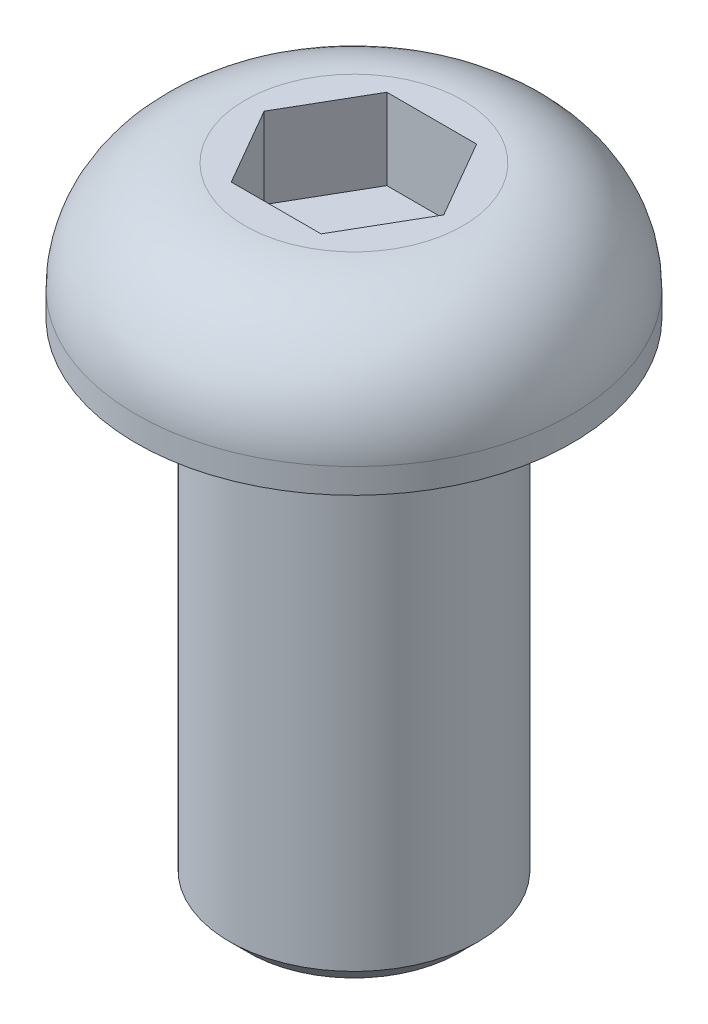
ISO-10303-21;
HEADER;
FILE_DESCRIPTION(('STEP AP214'),'2;1');
FILE_NAME('part.step','',(''),(''),'','','');
FILE_SCHEMA(('AUTOMOTIVE_DESIGN { 1 0 10303 214 1 1 1 1 }'));
ENDSEC;
DATA;
#1=APPLICATION_CONTEXT('core data for automotive mechanical design processes');
#2=APPLICATION_PROTOCOL_DEFINITION('international standard','automotive_design',2000,#1);
#3=PRODUCT_CONTEXT('',#1,'mechanical');
#4=PRODUCT('Part','Part','',(#3));
#5=PRODUCT_RELATED_PRODUCT_CATEGORY('part','',(#4));
#6=PRODUCT_DEFINITION_FORMATION('','',#4);
#7=PRODUCT_DEFINITION_CONTEXT('part definition',#1,'design');
#8=PRODUCT_DEFINITION('design','',#6,#7);
#9=PRODUCT_DEFINITION_SHAPE('','',#8);
#10=(LENGTH_UNIT() NAMED_UNIT(*) SI_UNIT(.MILLI.,.METRE.));
#11=(NAMED_UNIT(*) PLANE_ANGLE_UNIT() SI_UNIT($,.RADIAN.));
#12=(NAMED_UNIT(*) SI_UNIT($,.STERADIAN.) SOLID_ANGLE_UNIT());
#13=UNCERTAINTY_MEASURE_WITH_UNIT(LENGTH_MEASURE(1.E-05),#10,'distance_accuracy_value','');
#14=(GEOMETRIC_REPRESENTATION_CONTEXT(3) GLOBAL_UNCERTAINTY_ASSIGNED_CONTEXT((#13)) GLOBAL_UNIT_ASSIGNED_CONTEXT((#10,
#11,#12)) REPRESENTATION_CONTEXT('',''));
#15=CARTESIAN_POINT('',(0.,0.,0.));
#16=DIRECTION('',(0.,0.,1.));
#17=DIRECTION('',(1.,0.,0.));
#18=AXIS2_PLACEMENT_3D('',#15,#16,#17);
#19=CARTESIAN_POINT('',(0.,0.,0.));
#20=DIRECTION('',(0.,-1.,0.));
#21=DIRECTION('',(1.,0.,0.));
#22=AXIS2_PLACEMENT_3D('',#19,#20,#21);
#23=PLANE('',#22);
#24=DIRECTION('',(-0.5,0.,-0.866025403784439));
#25=VECTOR('',#24,1.);
#26=CARTESIAN_POINT('',(2.88675134594813,0.,0.));
#27=LINE('',#26,#25);
#28=CARTESIAN_POINT('',(2.88675134594813,0.,0.));
#29=VERTEX_POINT('',#28);
#30=CARTESIAN_POINT('',(1.44337567297406,0.,-2.5));
#31=VERTEX_POINT('',#30);
#32=EDGE_CURVE('E141',#29,#31,#27,.T.);
#33=ORIENTED_EDGE('',*,*,#32,.F.);
#34=DIRECTION('',(0.5,0.,-0.866025403784439));
#35=VECTOR('',#34,1.);
#36=CARTESIAN_POINT('',(1.44337567297407,0.,2.5));
#37=LINE('',#36,#35);
#38=CARTESIAN_POINT('',(1.44337567297407,0.,2.5));
#39=VERTEX_POINT('',#38);
#40=EDGE_CURVE('E67',#39,#29,#37,.T.);
#41=ORIENTED_EDGE('',*,*,#40,.F.);
#42=DIRECTION('',(1.,0.,0.));
#43=VECTOR('',#42,1.);
#44=CARTESIAN_POINT('',(-1.44337567297406,0.,2.5));
#45=LINE('',#44,#43);
#46=CARTESIAN_POINT('',(-1.44337567297406,0.,2.5));
#47=VERTEX_POINT('',#46);
#48=EDGE_CURVE('E150',#47,#39,#45,.T.);
#49=ORIENTED_EDGE('',*,*,#48,.F.);
#50=DIRECTION('',(0.5,0.,0.866025403784439));
#51=VECTOR('',#50,1.);
#52=CARTESIAN_POINT('',(-2.88675134594813,0.,0.));
#53=LINE('',#52,#51);
#54=CARTESIAN_POINT('',(-2.88675134594813,0.,0.));
#55=VERTEX_POINT('',#54);
#56=EDGE_CURVE('E148',#55,#47,#53,.T.);
#57=ORIENTED_EDGE('',*,*,#56,.F.);
#58=DIRECTION('',(-0.5,0.,0.866025403784439));
#59=VECTOR('',#58,1.);
#60=CARTESIAN_POINT('',(-1.44337567297406,0.,-2.5));
#61=LINE('',#60,#59);
#62=CARTESIAN_POINT('',(-1.44337567297406,0.,-2.5));
#63=VERTEX_POINT('',#62);
#64=EDGE_CURVE('E115',#63,#55,#61,.T.);
#65=ORIENTED_EDGE('',*,*,#64,.F.);
#66=DIRECTION('',(-1.,0.,0.));
#67=VECTOR('',#66,1.);
#68=CARTESIAN_POINT('',(1.44337567297406,0.,-2.5));
#69=LINE('',#68,#67);
#70=EDGE_CURVE('E144',#31,#63,#69,.T.);
#71=ORIENTED_EDGE('',*,*,#70,.F.);
#72=EDGE_LOOP('',(#33,#41,#49,#57,#65,#71));
#73=FACE_BOUND('',#72,.T.);
#74=CARTESIAN_POINT('',(0.,0.,0.));
#75=DIRECTION('',(0.,1.,0.));
#76=DIRECTION('',(-1.,0.,0.));
#77=AXIS2_PLACEMENT_3D('',#74,#75,#76);
#78=CIRCLE('',#77,3.5);
#79=CARTESIAN_POINT('',(-3.5,0.,0.));
#80=VERTEX_POINT('',#79);
#81=EDGE_CURVE('E165',#80,#80,#78,.T.);
#82=ORIENTED_EDGE('',*,*,#81,.T.);
#83=EDGE_LOOP('',(#82));
#84=FACE_BOUND('',#83,.T.);
#85=ADVANCED_FACE('F51',(#73,#84),#23,.F.);
#86=CARTESIAN_POINT('',(0.,-3.5,0.));
#87=DIRECTION('',(0.,1.,0.));
#88=DIRECTION('',(-1.,0.,0.));
#89=AXIS2_PLACEMENT_3D('',#86,#87,#88);
#90=DEGENERATE_TOROIDAL_SURFACE('',#89,3.5,3.5,.T.);
#91=ORIENTED_EDGE('',*,*,#81,.F.);
#92=EDGE_LOOP('',(#91));
#93=FACE_BOUND('',#92,.T.);
#94=CARTESIAN_POINT('',(0.,-3.5,0.));
#95=DIRECTION('',(0.,1.,0.));
#96=DIRECTION('',(-1.,0.,0.));
#97=AXIS2_PLACEMENT_3D('',#94,#95,#96);
#98=CIRCLE('',#97,7.);
#99=CARTESIAN_POINT('',(-7.,-3.5,0.));
#100=VERTEX_POINT('',#99);
#101=EDGE_CURVE('E162',#100,#100,#98,.T.);
#102=ORIENTED_EDGE('',*,*,#101,.T.);
#103=EDGE_LOOP('',(#102));
#104=FACE_BOUND('',#103,.T.);
#105=ADVANCED_FACE('F190',(#93,#104),#90,.T.);
#106=CARTESIAN_POINT('',(0.,5.,0.));
#107=DIRECTION('',(0.,1.,0.));
#108=DIRECTION('',(-1.,0.,0.));
#109=AXIS2_PLACEMENT_3D('',#106,#107,#108);
#110=CYLINDRICAL_SURFACE('',#109,7.);
#111=ORIENTED_EDGE('',*,*,#101,.F.);
#112=EDGE_LOOP('',(#111));
#113=FACE_BOUND('',#112,.T.);
#114=CARTESIAN_POINT('',(0.,-4.3,0.));
#115=DIRECTION('',(0.,1.,0.));
#116=DIRECTION('',(-1.,0.,0.));
#117=AXIS2_PLACEMENT_3D('',#114,#115,#116);
#118=CIRCLE('',#117,7.);
#119=CARTESIAN_POINT('',(-7.,-4.3,0.));
#120=VERTEX_POINT('',#119);
#121=EDGE_CURVE('E154',#120,#120,#118,.T.);
#122=ORIENTED_EDGE('',*,*,#121,.T.);
#123=EDGE_LOOP('',(#122));
#124=FACE_BOUND('',#123,.T.);
#125=ADVANCED_FACE('F198',(#113,#124),#110,.T.);
#126=CARTESIAN_POINT('',(7.,-4.3,0.));
#127=DIRECTION('',(0.,1.,0.));
#128=DIRECTION('',(-1.,0.,0.));
#129=AXIS2_PLACEMENT_3D('',#126,#127,#128);
#130=PLANE('',#129);
#131=CARTESIAN_POINT('',(0.,-4.3,0.));
#132=DIRECTION('',(0.,1.,0.));
#133=DIRECTION('',(-1.,0.,0.));
#134=AXIS2_PLACEMENT_3D('',#131,#132,#133);
#135=CIRCLE('',#134,4.4);
#136=CARTESIAN_POINT('',(-4.4,-4.3,0.));
#137=VERTEX_POINT('',#136);
#138=EDGE_CURVE('E168',#137,#137,#135,.T.);
#139=ORIENTED_EDGE('',*,*,#138,.T.);
#140=EDGE_LOOP('',(#139));
#141=FACE_BOUND('',#140,.T.);
#142=ORIENTED_EDGE('',*,*,#121,.F.);
#143=EDGE_LOOP('',(#142));
#144=FACE_BOUND('',#143,.T.);
#145=ADVANCED_FACE('F205',(#141,#144),#130,.F.);
#146=CARTESIAN_POINT('',(0.,5.,0.));
#147=DIRECTION('',(0.,1.,0.));
#148=DIRECTION('',(-1.,0.,0.));
#149=AXIS2_PLACEMENT_3D('',#146,#147,#148);
#150=CYLINDRICAL_SURFACE('',#149,4.);
#151=CARTESIAN_POINT('',(0.,-19.675,0.));
#152=DIRECTION('',(0.,1.,0.));
#153=DIRECTION('',(-1.,0.,0.));
#154=AXIS2_PLACEMENT_3D('',#151,#152,#153);
#155=CIRCLE('',#154,4.);
#156=CARTESIAN_POINT('',(-4.,-19.675,0.));
#157=VERTEX_POINT('',#156);
#158=EDGE_CURVE('E60',#157,#157,#155,.T.);
#159=ORIENTED_EDGE('',*,*,#158,.T.);
#160=EDGE_LOOP('',(#159));
#161=FACE_BOUND('',#160,.T.);
#162=CARTESIAN_POINT('',(0.,-4.7,0.));
#163=DIRECTION('',(0.,1.,0.));
#164=DIRECTION('',(-1.,0.,0.));
#165=AXIS2_PLACEMENT_3D('',#162,#163,#164);
#166=CIRCLE('',#165,4.);
#167=CARTESIAN_POINT('',(-4.,-4.7,0.));
#168=VERTEX_POINT('',#167);
#169=EDGE_CURVE('E171',#168,#168,#166,.F.);
#170=ORIENTED_EDGE('',*,*,#169,.T.);
#171=EDGE_LOOP('',(#170));
#172=FACE_BOUND('',#171,.T.);
#173=ADVANCED_FACE('F176',(#161,#172),#150,.T.);
#174=CARTESIAN_POINT('',(4.,-20.3,0.));
#175=DIRECTION('',(0.,1.,0.));
#176=DIRECTION('',(-1.,0.,0.));
#177=AXIS2_PLACEMENT_3D('',#174,#175,#176);
#178=PLANE('',#177);
#179=CARTESIAN_POINT('',(0.,-20.3,0.));
#180=DIRECTION('',(0.,1.,0.));
#181=DIRECTION('',(-1.,0.,0.));
#182=AXIS2_PLACEMENT_3D('',#179,#180,#181);
#183=CIRCLE('',#182,3.37499999999997);
#184=CARTESIAN_POINT('',(-3.37499999999997,-20.3,0.));
#185=VERTEX_POINT('',#184);
#186=EDGE_CURVE('E11',#185,#185,#183,.F.);
#187=ORIENTED_EDGE('',*,*,#186,.T.);
#188=EDGE_LOOP('',(#187));
#189=FACE_BOUND('',#188,.T.);
#190=ADVANCED_FACE('F212',(#189),#178,.F.);
#191=CARTESIAN_POINT('',(1.44337567297407,-2.6,2.5));
#192=DIRECTION('',(0.866025403784439,0.,0.5));
#193=DIRECTION('',(0.5,0.,-0.866025403784439));
#194=AXIS2_PLACEMENT_3D('',#191,#192,#193);
#195=PLANE('',#194);
#196=ORIENTED_EDGE('',*,*,#40,.T.);
#197=DIRECTION('',(0.,1.,0.));
#198=VECTOR('',#197,1.);
#199=CARTESIAN_POINT('',(2.88675134594813,-2.6,0.));
#200=LINE('',#199,#198);
#201=CARTESIAN_POINT('',(2.88675134594813,-2.6,0.));
#202=VERTEX_POINT('',#201);
#203=EDGE_CURVE('E97',#202,#29,#200,.T.);
#204=ORIENTED_EDGE('',*,*,#203,.F.);
#205=DIRECTION('',(0.5,0.,-0.866025403784439));
#206=VECTOR('',#205,1.);
#207=CARTESIAN_POINT('',(1.44337567297407,-2.6,2.5));
#208=LINE('',#207,#206);
#209=CARTESIAN_POINT('',(1.44337567297407,-2.6,2.5));
#210=VERTEX_POINT('',#209);
#211=EDGE_CURVE('E152',#210,#202,#208,.T.);
#212=ORIENTED_EDGE('',*,*,#211,.F.);
#213=DIRECTION('',(0.,1.,0.));
#214=VECTOR('',#213,1.);
#215=CARTESIAN_POINT('',(1.44337567297407,-2.6,2.5));
#216=LINE('',#215,#214);
#217=EDGE_CURVE('E75',#210,#39,#216,.T.);
#218=ORIENTED_EDGE('',*,*,#217,.T.);
#219=EDGE_LOOP('',(#196,#204,#212,#218));
#220=FACE_BOUND('',#219,.T.);
#221=ADVANCED_FACE('F215',(#220),#195,.F.);
#222=CARTESIAN_POINT('',(-1.44337567297406,-2.6,2.5));
#223=DIRECTION('',(0.,0.,1.));
#224=DIRECTION('',(1.,0.,0.));
#225=AXIS2_PLACEMENT_3D('',#222,#223,#224);
#226=PLANE('',#225);
#227=ORIENTED_EDGE('',*,*,#48,.T.);
#228=ORIENTED_EDGE('',*,*,#217,.F.);
#229=DIRECTION('',(1.,0.,0.));
#230=VECTOR('',#229,1.);
#231=CARTESIAN_POINT('',(-1.44337567297406,-2.6,2.5));
#232=LINE('',#231,#230);
#233=CARTESIAN_POINT('',(-1.44337567297406,-2.6,2.5));
#234=VERTEX_POINT('',#233);
#235=EDGE_CURVE('E127',#234,#210,#232,.T.);
#236=ORIENTED_EDGE('',*,*,#235,.F.);
#237=DIRECTION('',(0.,1.,0.));
#238=VECTOR('',#237,1.);
#239=CARTESIAN_POINT('',(-1.44337567297406,-2.6,2.5));
#240=LINE('',#239,#238);
#241=EDGE_CURVE('E119',#234,#47,#240,.T.);
#242=ORIENTED_EDGE('',*,*,#241,.T.);
#243=EDGE_LOOP('',(#227,#228,#236,#242));
#244=FACE_BOUND('',#243,.T.);
#245=ADVANCED_FACE('F218',(#244),#226,.F.);
#246=CARTESIAN_POINT('',(-2.88675134594813,-2.6,0.));
#247=DIRECTION('',(-0.866025403784439,0.,0.5));
#248=DIRECTION('',(0.5,0.,0.866025403784439));
#249=AXIS2_PLACEMENT_3D('',#246,#247,#248);
#250=PLANE('',#249);
#251=ORIENTED_EDGE('',*,*,#56,.T.);
#252=ORIENTED_EDGE('',*,*,#241,.F.);
#253=DIRECTION('',(0.5,0.,0.866025403784439));
#254=VECTOR('',#253,1.);
#255=CARTESIAN_POINT('',(-2.88675134594813,-2.6,0.));
#256=LINE('',#255,#254);
#257=CARTESIAN_POINT('',(-2.88675134594813,-2.6,0.));
#258=VERTEX_POINT('',#257);
#259=EDGE_CURVE('E123',#258,#234,#256,.T.);
#260=ORIENTED_EDGE('',*,*,#259,.F.);
#261=DIRECTION('',(0.,1.,0.));
#262=VECTOR('',#261,1.);
#263=CARTESIAN_POINT('',(-2.88675134594813,-2.6,0.));
#264=LINE('',#263,#262);
#265=EDGE_CURVE('E108',#258,#55,#264,.T.);
#266=ORIENTED_EDGE('',*,*,#265,.T.);
#267=EDGE_LOOP('',(#251,#252,#260,#266));
#268=FACE_BOUND('',#267,.T.);
#269=ADVANCED_FACE('F124',(#268),#250,.F.);
#270=CARTESIAN_POINT('',(-1.44337567297406,-2.6,-2.5));
#271=DIRECTION('',(-0.866025403784439,0.,-0.5));
#272=DIRECTION('',(-0.5,0.,0.866025403784439));
#273=AXIS2_PLACEMENT_3D('',#270,#271,#272);
#274=PLANE('',#273);
#275=ORIENTED_EDGE('',*,*,#64,.T.);
#276=ORIENTED_EDGE('',*,*,#265,.F.);
#277=DIRECTION('',(-0.5,0.,0.866025403784439));
#278=VECTOR('',#277,1.);
#279=CARTESIAN_POINT('',(-1.44337567297406,-2.6,-2.5));
#280=LINE('',#279,#278);
#281=CARTESIAN_POINT('',(-1.44337567297406,-2.6,-2.5));
#282=VERTEX_POINT('',#281);
#283=EDGE_CURVE('E112',#282,#258,#280,.T.);
#284=ORIENTED_EDGE('',*,*,#283,.F.);
#285=DIRECTION('',(0.,1.,0.));
#286=VECTOR('',#285,1.);
#287=CARTESIAN_POINT('',(-1.44337567297406,-2.6,-2.5));
#288=LINE('',#287,#286);
#289=EDGE_CURVE('E120',#282,#63,#288,.T.);
#290=ORIENTED_EDGE('',*,*,#289,.T.);
#291=EDGE_LOOP('',(#275,#276,#284,#290));
#292=FACE_BOUND('',#291,.T.);
#293=ADVANCED_FACE('F110',(#292),#274,.F.);
#294=CARTESIAN_POINT('',(1.44337567297406,-2.6,-2.5));
#295=DIRECTION('',(0.,0.,-1.));
#296=DIRECTION('',(-1.,0.,0.));
#297=AXIS2_PLACEMENT_3D('',#294,#295,#296);
#298=PLANE('',#297);
#299=ORIENTED_EDGE('',*,*,#70,.T.);
#300=ORIENTED_EDGE('',*,*,#289,.F.);
#301=DIRECTION('',(-1.,0.,0.));
#302=VECTOR('',#301,1.);
#303=CARTESIAN_POINT('',(1.44337567297406,-2.6,-2.5));
#304=LINE('',#303,#302);
#305=CARTESIAN_POINT('',(1.44337567297406,-2.6,-2.5));
#306=VERTEX_POINT('',#305);
#307=EDGE_CURVE('E133',#306,#282,#304,.T.);
#308=ORIENTED_EDGE('',*,*,#307,.F.);
#309=DIRECTION('',(0.,1.,0.));
#310=VECTOR('',#309,1.);
#311=CARTESIAN_POINT('',(1.44337567297406,-2.6,-2.5));
#312=LINE('',#311,#310);
#313=EDGE_CURVE('E157',#306,#31,#312,.T.);
#314=ORIENTED_EDGE('',*,*,#313,.T.);
#315=EDGE_LOOP('',(#299,#300,#308,#314));
#316=FACE_BOUND('',#315,.T.);
#317=ADVANCED_FACE('F222',(#316),#298,.F.);
#318=CARTESIAN_POINT('',(2.88675134594813,-2.6,0.));
#319=DIRECTION('',(0.866025403784439,0.,-0.5));
#320=DIRECTION('',(-0.5,0.,-0.866025403784439));
#321=AXIS2_PLACEMENT_3D('',#318,#319,#320);
#322=PLANE('',#321);
#323=ORIENTED_EDGE('',*,*,#32,.T.);
#324=ORIENTED_EDGE('',*,*,#313,.F.);
#325=DIRECTION('',(-0.5,0.,-0.866025403784439));
#326=VECTOR('',#325,1.);
#327=CARTESIAN_POINT('',(2.88675134594813,-2.6,0.));
#328=LINE('',#327,#326);
#329=EDGE_CURVE('E135',#202,#306,#328,.T.);
#330=ORIENTED_EDGE('',*,*,#329,.F.);
#331=ORIENTED_EDGE('',*,*,#203,.T.);
#332=EDGE_LOOP('',(#323,#324,#330,#331));
#333=FACE_BOUND('',#332,.T.);
#334=ADVANCED_FACE('F219',(#333),#322,.F.);
#335=CARTESIAN_POINT('',(0.,-2.6,0.));
#336=DIRECTION('',(0.,1.,0.));
#337=DIRECTION('',(-1.,0.,0.));
#338=AXIS2_PLACEMENT_3D('',#335,#336,#337);
#339=PLANE('',#338);
#340=ORIENTED_EDGE('',*,*,#211,.T.);
#341=ORIENTED_EDGE('',*,*,#329,.T.);
#342=ORIENTED_EDGE('',*,*,#307,.T.);
#343=ORIENTED_EDGE('',*,*,#283,.T.);
#344=ORIENTED_EDGE('',*,*,#259,.T.);
#345=ORIENTED_EDGE('',*,*,#235,.T.);
#346=EDGE_LOOP('',(#340,#341,#342,#343,#344,#345));
#347=FACE_BOUND('',#346,.T.);
#348=ADVANCED_FACE('F130',(#347),#339,.T.);
#349=CARTESIAN_POINT('',(0.,-4.7,0.));
#350=DIRECTION('',(0.,1.,0.));
#351=DIRECTION('',(-1.,0.,0.));
#352=AXIS2_PLACEMENT_3D('',#349,#350,#351);
#353=TOROIDAL_SURFACE('',#352,4.4,0.4);
#354=ORIENTED_EDGE('',*,*,#169,.F.);
#355=EDGE_LOOP('',(#354));
#356=FACE_BOUND('',#355,.T.);
#357=ORIENTED_EDGE('',*,*,#138,.F.);
#358=EDGE_LOOP('',(#357));
#359=FACE_BOUND('',#358,.T.);
#360=ADVANCED_FACE('F180',(#356,#359),#353,.F.);
#361=CARTESIAN_POINT('',(0.,-19.675,0.));
#362=DIRECTION('',(0.,1.,0.));
#363=DIRECTION('',(-1.,0.,0.));
#364=AXIS2_PLACEMENT_3D('',#361,#362,#363);
#365=CONICAL_SURFACE('',#364,4.,0.785398163397455);
#366=CARTESIAN_POINT('',(-3.37499999999997,-20.3,0.));
#367=CARTESIAN_POINT('',(-3.38151041666664,-20.2934895833333,0.));
#368=CARTESIAN_POINT('',(-3.3880208333333,-20.2869791666667,0.));
#369=CARTESIAN_POINT('',(-3.40104166666664,-20.2739583333333,0.));
#370=CARTESIAN_POINT('',(-3.4075520833333,-20.2674479166667,0.));
#371=CARTESIAN_POINT('',(-3.42057291666664,-20.2544270833333,0.));
#372=CARTESIAN_POINT('',(-3.42708333333331,-20.2479166666667,0.));
#373=CARTESIAN_POINT('',(-3.44010416666664,-20.2348958333333,0.));
#374=CARTESIAN_POINT('',(-3.44661458333331,-20.2283854166667,0.));
#375=CARTESIAN_POINT('',(-3.45963541666664,-20.2153645833333,0.));
#376=CARTESIAN_POINT('',(-3.46614583333331,-20.2088541666667,0.));
#377=CARTESIAN_POINT('',(-3.47916666666664,-20.1958333333333,0.));
#378=CARTESIAN_POINT('',(-3.48567708333331,-20.1893229166667,0.));
#379=CARTESIAN_POINT('',(-3.49869791666664,-20.1763020833333,0.));
#380=CARTESIAN_POINT('',(-3.50520833333331,-20.1697916666667,0.));
#381=CARTESIAN_POINT('',(-3.51822916666664,-20.1567708333333,0.));
#382=CARTESIAN_POINT('',(-3.52473958333331,-20.1502604166667,0.));
#383=CARTESIAN_POINT('',(-3.53776041666664,-20.1372395833333,0.));
#384=CARTESIAN_POINT('',(-3.54427083333331,-20.1307291666667,0.));
#385=CARTESIAN_POINT('',(-3.55729166666664,-20.1177083333333,0.));
#386=CARTESIAN_POINT('',(-3.56380208333331,-20.1111979166667,0.));
#387=CARTESIAN_POINT('',(-3.57682291666664,-20.0981770833333,0.));
#388=CARTESIAN_POINT('',(-3.58333333333331,-20.0916666666667,0.));
#389=CARTESIAN_POINT('',(-3.59635416666664,-20.0786458333333,0.));
#390=CARTESIAN_POINT('',(-3.60286458333331,-20.0721354166667,0.));
#391=CARTESIAN_POINT('',(-3.61588541666665,-20.0591145833333,0.));
#392=CARTESIAN_POINT('',(-3.62239583333331,-20.0526041666667,0.));
#393=CARTESIAN_POINT('',(-3.63541666666665,-20.0395833333333,0.));
#394=CARTESIAN_POINT('',(-3.64192708333331,-20.0330729166667,0.));
#395=CARTESIAN_POINT('',(-3.65494791666665,-20.0200520833333,0.));
#396=CARTESIAN_POINT('',(-3.66145833333331,-20.0135416666667,0.));
#397=CARTESIAN_POINT('',(-3.67447916666665,-20.0005208333333,0.));
#398=CARTESIAN_POINT('',(-3.68098958333332,-19.9940104166667,0.));
#399=CARTESIAN_POINT('',(-3.69401041666665,-19.9809895833333,0.));
#400=CARTESIAN_POINT('',(-3.70052083333332,-19.9744791666667,0.));
#401=CARTESIAN_POINT('',(-3.71354166666665,-19.9614583333333,0.));
#402=CARTESIAN_POINT('',(-3.72005208333332,-19.9549479166667,0.));
#403=CARTESIAN_POINT('',(-3.73307291666665,-19.9419270833333,0.));
#404=CARTESIAN_POINT('',(-3.73958333333332,-19.9354166666667,0.));
#405=CARTESIAN_POINT('',(-3.75260416666665,-19.9223958333333,0.));
#406=CARTESIAN_POINT('',(-3.75911458333332,-19.9158854166667,0.));
#407=CARTESIAN_POINT('',(-3.77213541666665,-19.9028645833333,0.));
#408=CARTESIAN_POINT('',(-3.77864583333332,-19.8963541666667,0.));
#409=CARTESIAN_POINT('',(-3.79166666666665,-19.8833333333333,0.));
#410=CARTESIAN_POINT('',(-3.79817708333332,-19.8768229166667,0.));
#411=CARTESIAN_POINT('',(-3.81119791666665,-19.8638020833333,0.));
#412=CARTESIAN_POINT('',(-3.81770833333332,-19.8572916666667,0.));
#413=CARTESIAN_POINT('',(-3.83072916666665,-19.8442708333333,0.));
#414=CARTESIAN_POINT('',(-3.83723958333332,-19.8377604166667,0.));
#415=CARTESIAN_POINT('',(-3.85026041666666,-19.8247395833333,0.));
#416=CARTESIAN_POINT('',(-3.85677083333332,-19.8182291666667,0.));
#417=CARTESIAN_POINT('',(-3.86979166666666,-19.8052083333333,0.));
#418=CARTESIAN_POINT('',(-3.87630208333332,-19.7986979166667,0.));
#419=CARTESIAN_POINT('',(-3.88932291666666,-19.7856770833333,0.));
#420=CARTESIAN_POINT('',(-3.89583333333332,-19.7791666666667,0.));
#421=CARTESIAN_POINT('',(-3.90885416666666,-19.7661458333333,0.));
#422=CARTESIAN_POINT('',(-3.91536458333333,-19.7596354166667,0.));
#423=CARTESIAN_POINT('',(-3.92838541666666,-19.7466145833333,0.));
#424=CARTESIAN_POINT('',(-3.93489583333333,-19.7401041666667,0.));
#425=CARTESIAN_POINT('',(-3.94791666666666,-19.7270833333333,0.));
#426=CARTESIAN_POINT('',(-3.95442708333333,-19.7205729166667,0.));
#427=CARTESIAN_POINT('',(-3.96744791666666,-19.7075520833333,0.));
#428=CARTESIAN_POINT('',(-3.97395833333333,-19.7010416666667,0.));
#429=CARTESIAN_POINT('',(-3.98697916666666,-19.6880208333333,0.));
#430=CARTESIAN_POINT('',(-3.99348958333333,-19.6815104166666,0.));
#431=CARTESIAN_POINT('',(-4.,-19.675,0.));
#432=B_SPLINE_CURVE_WITH_KNOTS('',3,(#366,#367,#368,#369,#370,#371,#372,#373,#374,#375,#376,
#377,#378,#379,#380,#381,#382,#383,#384,#385,#386,#387,#388,#389,#390,#391,#392,#393,#394,#395,
#396,#397,#398,#399,#400,#401,#402,#403,#404,#405,#406,#407,#408,#409,#410,#411,#412,#413,#414,
#415,#416,#417,#418,#419,#420,#421,#422,#423,#424,#425,#426,#427,#428,#429,#430,#431),
.UNSPECIFIED.,.F.,.F.,(4,2,2,2,2,2,2,2,2,2,2,2,2,2,2,2,2,2,2,2,2,2,2,2,2,2,2,2,2,2,2,2,4),(0.,
0.0276213586401023,0.0552427172802021,0.082864075920302,0.110485434560404,0.138106793200504,
0.165728151840604,0.193349510480704,0.220970869120806,0.248592227760906,0.276213586401005,
0.303834945041107,0.331456303681207,0.359077662321307,0.386699020961407,0.414320379601509,
0.441941738241609,0.469563096881709,0.497184455521811,0.524805814161911,0.552427172802011,
0.58004853144211,0.607669890082213,0.635291248722312,0.662912607362412,0.690533966002514,
0.718155324642614,0.745776683282714,0.773398041922814,0.801019400562917,0.828640759203016,
0.856262117843116,0.883883476483218),.UNSPECIFIED.);
#433=EDGE_CURVE('BSEAM54',#185,#157,#432,.T.);
#434=ORIENTED_EDGE('',*,*,#186,.F.);
#435=ORIENTED_EDGE('',*,*,#158,.F.);
#436=ORIENTED_EDGE('',*,*,#433,.T.);
#437=ORIENTED_EDGE('',*,*,#433,.F.);
#438=EDGE_LOOP('',(#434,#436,#435,#437));
#439=FACE_BOUND('',#438,.T.);
#440=ADVANCED_FACE('F54',(#439),#365,.T.);
#441=CLOSED_SHELL('',(#85,#105,#125,#145,#173,#190,#221,#245,#269,#293,#317,#334,#348,#360,#440));
#442=MANIFOLD_SOLID_BREP('B2',#441);
#443=ADVANCED_BREP_SHAPE_REPRESENTATION('',(#18,#442),#14);
#444=SHAPE_DEFINITION_REPRESENTATION(#9,#443);
ENDSEC;
END-ISO-10303-21;
